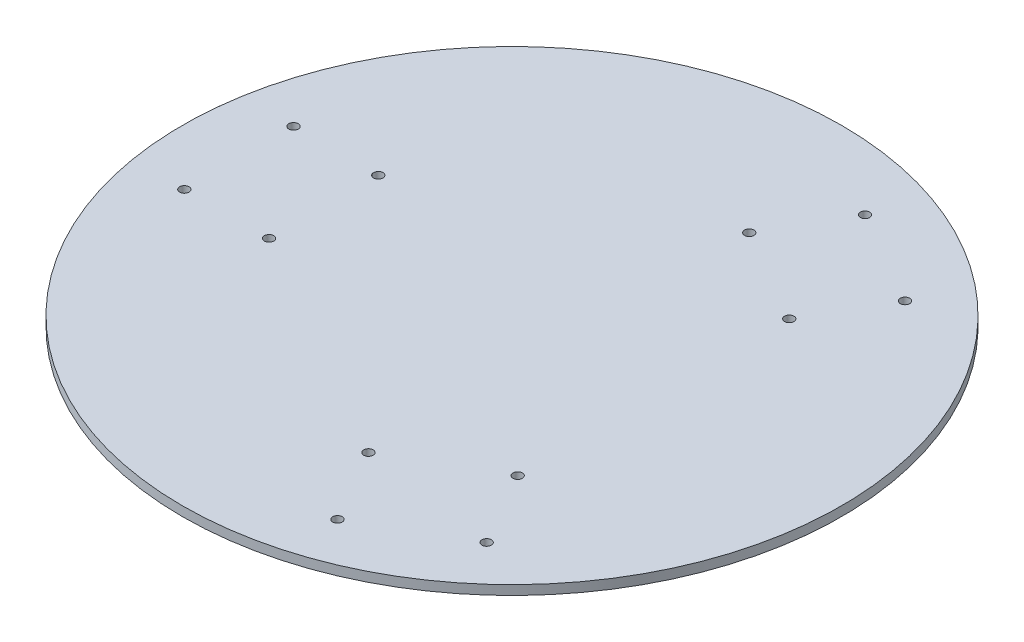
ISO-10303-21;
HEADER;
FILE_DESCRIPTION(('STEP AP214'),'2;1');
FILE_NAME('part.step','',(''),(''),'','','');
FILE_SCHEMA(('AUTOMOTIVE_DESIGN { 1 0 10303 214 1 1 1 1 }'));
ENDSEC;
DATA;
#1=APPLICATION_CONTEXT('core data for automotive mechanical design processes');
#2=APPLICATION_PROTOCOL_DEFINITION('international standard','automotive_design',2000,#1);
#3=PRODUCT_CONTEXT('',#1,'mechanical');
#4=PRODUCT('Part','Part','',(#3));
#5=PRODUCT_RELATED_PRODUCT_CATEGORY('part','',(#4));
#6=PRODUCT_DEFINITION_FORMATION('','',#4);
#7=PRODUCT_DEFINITION_CONTEXT('part definition',#1,'design');
#8=PRODUCT_DEFINITION('design','',#6,#7);
#9=PRODUCT_DEFINITION_SHAPE('','',#8);
#10=(LENGTH_UNIT() NAMED_UNIT(*) SI_UNIT(.MILLI.,.METRE.));
#11=(NAMED_UNIT(*) PLANE_ANGLE_UNIT() SI_UNIT($,.RADIAN.));
#12=(NAMED_UNIT(*) SI_UNIT($,.STERADIAN.) SOLID_ANGLE_UNIT());
#13=UNCERTAINTY_MEASURE_WITH_UNIT(LENGTH_MEASURE(1.E-05),#10,'distance_accuracy_value','');
#14=(GEOMETRIC_REPRESENTATION_CONTEXT(3) GLOBAL_UNCERTAINTY_ASSIGNED_CONTEXT((#13)) GLOBAL_UNIT_ASSIGNED_CONTEXT((#10,
#11,#12)) REPRESENTATION_CONTEXT('',''));
#15=CARTESIAN_POINT('',(0.,0.,0.));
#16=DIRECTION('',(0.,0.,1.));
#17=DIRECTION('',(1.,0.,0.));
#18=AXIS2_PLACEMENT_3D('',#15,#16,#17);
#19=CARTESIAN_POINT('',(0.,5.,0.));
#20=DIRECTION('',(0.,-1.,0.));
#21=DIRECTION('',(0.,0.,-1.));
#22=AXIS2_PLACEMENT_3D('',#19,#20,#21);
#23=CYLINDRICAL_SURFACE('',#22,175.);
#24=CARTESIAN_POINT('',(0.,5.,0.));
#25=DIRECTION('',(0.,1.,0.));
#26=DIRECTION('',(0.,0.,1.));
#27=AXIS2_PLACEMENT_3D('',#24,#25,#26);
#28=CIRCLE('',#27,175.);
#29=CARTESIAN_POINT('',(0.,5.,175.));
#30=VERTEX_POINT('',#29);
#31=EDGE_CURVE('E10',#30,#30,#28,.T.);
#32=ORIENTED_EDGE('',*,*,#31,.F.);
#33=EDGE_LOOP('',(#32));
#34=FACE_BOUND('',#33,.T.);
#35=CARTESIAN_POINT('',(0.,0.,0.));
#36=DIRECTION('',(0.,1.,0.));
#37=DIRECTION('',(0.,0.,1.));
#38=AXIS2_PLACEMENT_3D('',#35,#36,#37);
#39=CIRCLE('',#38,175.);
#40=CARTESIAN_POINT('',(0.,0.,175.));
#41=VERTEX_POINT('',#40);
#42=EDGE_CURVE('E38',#41,#41,#39,.T.);
#43=ORIENTED_EDGE('',*,*,#42,.T.);
#44=EDGE_LOOP('',(#43));
#45=FACE_BOUND('',#44,.T.);
#46=ADVANCED_FACE('F35',(#34,#45),#23,.T.);
#47=CARTESIAN_POINT('',(0.,5.,0.));
#48=DIRECTION('',(0.,1.,0.));
#49=DIRECTION('',(0.,0.,1.));
#50=AXIS2_PLACEMENT_3D('',#47,#48,#49);
#51=PLANE('',#50);
#52=CARTESIAN_POINT('',(97.614736709762,5.,111.073683548731));
#53=DIRECTION('',(0.,1.,0.));
#54=DIRECTION('',(0.,0.,1.));
#55=AXIS2_PLACEMENT_3D('',#52,#53,#54);
#56=CIRCLE('',#55,2.50000000000001);
#57=CARTESIAN_POINT('',(97.614736709762,5.,113.573683548731));
#58=VERTEX_POINT('',#57);
#59=EDGE_CURVE('E110',#58,#58,#56,.T.);
#60=ORIENTED_EDGE('',*,*,#59,.F.);
#61=EDGE_LOOP('',(#60));
#62=FACE_BOUND('',#61,.T.);
#63=CARTESIAN_POINT('',(47.3852632902646,5.,140.073683548731));
#64=DIRECTION('',(0.,1.,0.));
#65=DIRECTION('',(0.,0.,1.));
#66=AXIS2_PLACEMENT_3D('',#63,#64,#65);
#67=CIRCLE('',#66,2.50000000000001);
#68=CARTESIAN_POINT('',(47.3852632902646,5.,142.573683548731));
#69=VERTEX_POINT('',#68);
#70=EDGE_CURVE('E104',#69,#69,#67,.T.);
#71=ORIENTED_EDGE('',*,*,#70,.F.);
#72=EDGE_LOOP('',(#71));
#73=FACE_BOUND('',#72,.T.);
#74=CARTESIAN_POINT('',(75.1147367097619,5.,72.102540378431));
#75=DIRECTION('',(0.,1.,0.));
#76=DIRECTION('',(0.,0.,1.));
#77=AXIS2_PLACEMENT_3D('',#74,#75,#76);
#78=CIRCLE('',#77,2.5);
#79=CARTESIAN_POINT('',(75.1147367097619,5.,74.602540378431));
#80=VERTEX_POINT('',#79);
#81=EDGE_CURVE('E98',#80,#80,#78,.T.);
#82=ORIENTED_EDGE('',*,*,#81,.F.);
#83=EDGE_LOOP('',(#82));
#84=FACE_BOUND('',#83,.T.);
#85=CARTESIAN_POINT('',(24.8852632902645,5.,101.102540378431));
#86=DIRECTION('',(0.,1.,0.));
#87=DIRECTION('',(0.,0.,1.));
#88=AXIS2_PLACEMENT_3D('',#85,#86,#87);
#89=CIRCLE('',#88,2.5);
#90=CARTESIAN_POINT('',(24.8852632902645,5.,103.602540378431));
#91=VERTEX_POINT('',#90);
#92=EDGE_CURVE('E92',#91,#91,#89,.T.);
#93=ORIENTED_EDGE('',*,*,#92,.F.);
#94=EDGE_LOOP('',(#93));
#95=FACE_BOUND('',#94,.T.);
#96=CARTESIAN_POINT('',(-100.,5.,29.));
#97=DIRECTION('',(0.,1.,0.));
#98=DIRECTION('',(0.,0.,1.));
#99=AXIS2_PLACEMENT_3D('',#96,#97,#98);
#100=CIRCLE('',#99,2.50000000000001);
#101=CARTESIAN_POINT('',(-100.,5.,31.5));
#102=VERTEX_POINT('',#101);
#103=EDGE_CURVE('E86',#102,#102,#100,.T.);
#104=ORIENTED_EDGE('',*,*,#103,.F.);
#105=EDGE_LOOP('',(#104));
#106=FACE_BOUND('',#105,.T.);
#107=CARTESIAN_POINT('',(-100.,5.,-29.));
#108=DIRECTION('',(0.,1.,0.));
#109=DIRECTION('',(0.,0.,1.));
#110=AXIS2_PLACEMENT_3D('',#107,#108,#109);
#111=CIRCLE('',#110,2.5);
#112=CARTESIAN_POINT('',(-100.,5.,-26.5));
#113=VERTEX_POINT('',#112);
#114=EDGE_CURVE('E80',#113,#113,#111,.T.);
#115=ORIENTED_EDGE('',*,*,#114,.F.);
#116=EDGE_LOOP('',(#115));
#117=FACE_BOUND('',#116,.T.);
#118=CARTESIAN_POINT('',(-145.,5.,29.));
#119=DIRECTION('',(0.,1.,0.));
#120=DIRECTION('',(0.,0.,1.));
#121=AXIS2_PLACEMENT_3D('',#118,#119,#120);
#122=CIRCLE('',#121,2.5);
#123=CARTESIAN_POINT('',(-145.,5.,31.5));
#124=VERTEX_POINT('',#123);
#125=EDGE_CURVE('E74',#124,#124,#122,.T.);
#126=ORIENTED_EDGE('',*,*,#125,.F.);
#127=EDGE_LOOP('',(#126));
#128=FACE_BOUND('',#127,.T.);
#129=CARTESIAN_POINT('',(-145.,5.,-29.));
#130=DIRECTION('',(0.,1.,0.));
#131=DIRECTION('',(0.,0.,1.));
#132=AXIS2_PLACEMENT_3D('',#129,#130,#131);
#133=CIRCLE('',#132,2.5);
#134=CARTESIAN_POINT('',(-145.,5.,-26.5));
#135=VERTEX_POINT('',#134);
#136=EDGE_CURVE('E68',#135,#135,#133,.T.);
#137=ORIENTED_EDGE('',*,*,#136,.F.);
#138=EDGE_LOOP('',(#137));
#139=FACE_BOUND('',#138,.T.);
#140=CARTESIAN_POINT('',(75.1147367097442,5.,-72.1025403784617));
#141=DIRECTION('',(0.,1.,0.));
#142=DIRECTION('',(0.,0.,1.));
#143=AXIS2_PLACEMENT_3D('',#140,#141,#142);
#144=CIRCLE('',#143,2.5);
#145=CARTESIAN_POINT('',(75.1147367097442,5.,-69.6025403784617));
#146=VERTEX_POINT('',#145);
#147=EDGE_CURVE('E62',#146,#146,#144,.T.);
#148=ORIENTED_EDGE('',*,*,#147,.F.);
#149=EDGE_LOOP('',(#148));
#150=FACE_BOUND('',#149,.T.);
#151=CARTESIAN_POINT('',(24.8852632902468,5.,-101.102540378462));
#152=DIRECTION('',(0.,1.,0.));
#153=DIRECTION('',(0.,0.,1.));
#154=AXIS2_PLACEMENT_3D('',#151,#152,#153);
#155=CIRCLE('',#154,2.5);
#156=CARTESIAN_POINT('',(24.8852632902468,5.,-98.6025403784617));
#157=VERTEX_POINT('',#156);
#158=EDGE_CURVE('E56',#157,#157,#155,.T.);
#159=ORIENTED_EDGE('',*,*,#158,.F.);
#160=EDGE_LOOP('',(#159));
#161=FACE_BOUND('',#160,.T.);
#162=CARTESIAN_POINT('',(97.6147367097442,5.,-111.073683548761));
#163=DIRECTION('',(0.,1.,0.));
#164=DIRECTION('',(0.,0.,1.));
#165=AXIS2_PLACEMENT_3D('',#162,#163,#164);
#166=CIRCLE('',#165,2.5);
#167=CARTESIAN_POINT('',(97.6147367097442,5.,-108.573683548761));
#168=VERTEX_POINT('',#167);
#169=EDGE_CURVE('E50',#168,#168,#166,.T.);
#170=ORIENTED_EDGE('',*,*,#169,.F.);
#171=EDGE_LOOP('',(#170));
#172=FACE_BOUND('',#171,.T.);
#173=CARTESIAN_POINT('',(47.3852632902468,5.,-140.073683548761));
#174=DIRECTION('',(0.,1.,0.));
#175=DIRECTION('',(0.,0.,1.));
#176=AXIS2_PLACEMENT_3D('',#173,#174,#175);
#177=CIRCLE('',#176,2.5);
#178=CARTESIAN_POINT('',(47.3852632902468,5.,-137.573683548761));
#179=VERTEX_POINT('',#178);
#180=EDGE_CURVE('E47',#179,#179,#177,.T.);
#181=ORIENTED_EDGE('',*,*,#180,.F.);
#182=EDGE_LOOP('',(#181));
#183=FACE_BOUND('',#182,.T.);
#184=ORIENTED_EDGE('',*,*,#31,.T.);
#185=EDGE_LOOP('',(#184));
#186=FACE_BOUND('',#185,.T.);
#187=ADVANCED_FACE('F121',(#62,#73,#84,#95,#106,#117,#128,#139,#150,#161,#172,#183,#186),#51,.T.);
#188=CARTESIAN_POINT('',(0.,0.,0.));
#189=DIRECTION('',(0.,1.,0.));
#190=DIRECTION('',(0.,0.,1.));
#191=AXIS2_PLACEMENT_3D('',#188,#189,#190);
#192=PLANE('',#191);
#193=CARTESIAN_POINT('',(97.614736709762,0.,111.073683548731));
#194=DIRECTION('',(0.,1.,0.));
#195=DIRECTION('',(0.,0.,1.));
#196=AXIS2_PLACEMENT_3D('',#193,#194,#195);
#197=CIRCLE('',#196,2.50000000000001);
#198=CARTESIAN_POINT('',(97.614736709762,0.,113.573683548731));
#199=VERTEX_POINT('',#198);
#200=EDGE_CURVE('E113',#199,#199,#197,.T.);
#201=ORIENTED_EDGE('',*,*,#200,.T.);
#202=EDGE_LOOP('',(#201));
#203=FACE_BOUND('',#202,.T.);
#204=CARTESIAN_POINT('',(47.3852632902646,0.,140.073683548731));
#205=DIRECTION('',(0.,1.,0.));
#206=DIRECTION('',(0.,0.,1.));
#207=AXIS2_PLACEMENT_3D('',#204,#205,#206);
#208=CIRCLE('',#207,2.50000000000001);
#209=CARTESIAN_POINT('',(47.3852632902646,0.,142.573683548731));
#210=VERTEX_POINT('',#209);
#211=EDGE_CURVE('E107',#210,#210,#208,.T.);
#212=ORIENTED_EDGE('',*,*,#211,.T.);
#213=EDGE_LOOP('',(#212));
#214=FACE_BOUND('',#213,.T.);
#215=CARTESIAN_POINT('',(75.1147367097619,0.,72.102540378431));
#216=DIRECTION('',(0.,1.,0.));
#217=DIRECTION('',(0.,0.,1.));
#218=AXIS2_PLACEMENT_3D('',#215,#216,#217);
#219=CIRCLE('',#218,2.5);
#220=CARTESIAN_POINT('',(75.1147367097619,0.,74.602540378431));
#221=VERTEX_POINT('',#220);
#222=EDGE_CURVE('E101',#221,#221,#219,.T.);
#223=ORIENTED_EDGE('',*,*,#222,.T.);
#224=EDGE_LOOP('',(#223));
#225=FACE_BOUND('',#224,.T.);
#226=CARTESIAN_POINT('',(24.8852632902645,0.,101.102540378431));
#227=DIRECTION('',(0.,1.,0.));
#228=DIRECTION('',(0.,0.,1.));
#229=AXIS2_PLACEMENT_3D('',#226,#227,#228);
#230=CIRCLE('',#229,2.5);
#231=CARTESIAN_POINT('',(24.8852632902645,0.,103.602540378431));
#232=VERTEX_POINT('',#231);
#233=EDGE_CURVE('E95',#232,#232,#230,.T.);
#234=ORIENTED_EDGE('',*,*,#233,.T.);
#235=EDGE_LOOP('',(#234));
#236=FACE_BOUND('',#235,.T.);
#237=CARTESIAN_POINT('',(-100.,0.,29.));
#238=DIRECTION('',(0.,1.,0.));
#239=DIRECTION('',(0.,0.,1.));
#240=AXIS2_PLACEMENT_3D('',#237,#238,#239);
#241=CIRCLE('',#240,2.50000000000001);
#242=CARTESIAN_POINT('',(-100.,0.,31.5));
#243=VERTEX_POINT('',#242);
#244=EDGE_CURVE('E89',#243,#243,#241,.T.);
#245=ORIENTED_EDGE('',*,*,#244,.T.);
#246=EDGE_LOOP('',(#245));
#247=FACE_BOUND('',#246,.T.);
#248=CARTESIAN_POINT('',(-100.,0.,-29.));
#249=DIRECTION('',(0.,1.,0.));
#250=DIRECTION('',(0.,0.,1.));
#251=AXIS2_PLACEMENT_3D('',#248,#249,#250);
#252=CIRCLE('',#251,2.5);
#253=CARTESIAN_POINT('',(-100.,0.,-26.5));
#254=VERTEX_POINT('',#253);
#255=EDGE_CURVE('E83',#254,#254,#252,.T.);
#256=ORIENTED_EDGE('',*,*,#255,.T.);
#257=EDGE_LOOP('',(#256));
#258=FACE_BOUND('',#257,.T.);
#259=CARTESIAN_POINT('',(-145.,0.,29.));
#260=DIRECTION('',(0.,1.,0.));
#261=DIRECTION('',(0.,0.,1.));
#262=AXIS2_PLACEMENT_3D('',#259,#260,#261);
#263=CIRCLE('',#262,2.5);
#264=CARTESIAN_POINT('',(-145.,0.,31.5));
#265=VERTEX_POINT('',#264);
#266=EDGE_CURVE('E77',#265,#265,#263,.T.);
#267=ORIENTED_EDGE('',*,*,#266,.T.);
#268=EDGE_LOOP('',(#267));
#269=FACE_BOUND('',#268,.T.);
#270=CARTESIAN_POINT('',(-145.,0.,-29.));
#271=DIRECTION('',(0.,1.,0.));
#272=DIRECTION('',(0.,0.,1.));
#273=AXIS2_PLACEMENT_3D('',#270,#271,#272);
#274=CIRCLE('',#273,2.5);
#275=CARTESIAN_POINT('',(-145.,0.,-26.5));
#276=VERTEX_POINT('',#275);
#277=EDGE_CURVE('E71',#276,#276,#274,.T.);
#278=ORIENTED_EDGE('',*,*,#277,.T.);
#279=EDGE_LOOP('',(#278));
#280=FACE_BOUND('',#279,.T.);
#281=CARTESIAN_POINT('',(75.1147367097442,0.,-72.1025403784617));
#282=DIRECTION('',(0.,1.,0.));
#283=DIRECTION('',(0.,0.,1.));
#284=AXIS2_PLACEMENT_3D('',#281,#282,#283);
#285=CIRCLE('',#284,2.5);
#286=CARTESIAN_POINT('',(75.1147367097442,0.,-69.6025403784617));
#287=VERTEX_POINT('',#286);
#288=EDGE_CURVE('E65',#287,#287,#285,.T.);
#289=ORIENTED_EDGE('',*,*,#288,.T.);
#290=EDGE_LOOP('',(#289));
#291=FACE_BOUND('',#290,.T.);
#292=CARTESIAN_POINT('',(24.8852632902468,0.,-101.102540378462));
#293=DIRECTION('',(0.,1.,0.));
#294=DIRECTION('',(0.,0.,1.));
#295=AXIS2_PLACEMENT_3D('',#292,#293,#294);
#296=CIRCLE('',#295,2.5);
#297=CARTESIAN_POINT('',(24.8852632902468,0.,-98.6025403784617));
#298=VERTEX_POINT('',#297);
#299=EDGE_CURVE('E59',#298,#298,#296,.T.);
#300=ORIENTED_EDGE('',*,*,#299,.T.);
#301=EDGE_LOOP('',(#300));
#302=FACE_BOUND('',#301,.T.);
#303=CARTESIAN_POINT('',(97.6147367097442,0.,-111.073683548761));
#304=DIRECTION('',(0.,1.,0.));
#305=DIRECTION('',(0.,0.,1.));
#306=AXIS2_PLACEMENT_3D('',#303,#304,#305);
#307=CIRCLE('',#306,2.5);
#308=CARTESIAN_POINT('',(97.6147367097442,0.,-108.573683548761));
#309=VERTEX_POINT('',#308);
#310=EDGE_CURVE('E53',#309,#309,#307,.T.);
#311=ORIENTED_EDGE('',*,*,#310,.T.);
#312=EDGE_LOOP('',(#311));
#313=FACE_BOUND('',#312,.T.);
#314=CARTESIAN_POINT('',(47.3852632902468,0.,-140.073683548761));
#315=DIRECTION('',(0.,1.,0.));
#316=DIRECTION('',(0.,0.,1.));
#317=AXIS2_PLACEMENT_3D('',#314,#315,#316);
#318=CIRCLE('',#317,2.5);
#319=CARTESIAN_POINT('',(47.3852632902468,0.,-137.573683548761));
#320=VERTEX_POINT('',#319);
#321=EDGE_CURVE('E45',#320,#320,#318,.T.);
#322=ORIENTED_EDGE('',*,*,#321,.T.);
#323=EDGE_LOOP('',(#322));
#324=FACE_BOUND('',#323,.T.);
#325=ORIENTED_EDGE('',*,*,#42,.F.);
#326=EDGE_LOOP('',(#325));
#327=FACE_BOUND('',#326,.T.);
#328=ADVANCED_FACE('F124',(#203,#214,#225,#236,#247,#258,#269,#280,#291,#302,#313,#324,#327),
#192,.F.);
#329=CARTESIAN_POINT('',(47.3852632902468,0.,-140.073683548761));
#330=DIRECTION('',(0.,1.,0.));
#331=DIRECTION('',(0.,0.,1.));
#332=AXIS2_PLACEMENT_3D('',#329,#330,#331);
#333=CYLINDRICAL_SURFACE('',#332,2.5);
#334=ORIENTED_EDGE('',*,*,#321,.F.);
#335=EDGE_LOOP('',(#334));
#336=FACE_BOUND('',#335,.T.);
#337=ORIENTED_EDGE('',*,*,#180,.T.);
#338=EDGE_LOOP('',(#337));
#339=FACE_BOUND('',#338,.T.);
#340=ADVANCED_FACE('F148',(#336,#339),#333,.F.);
#341=CARTESIAN_POINT('',(97.6147367097442,0.,-111.073683548761));
#342=DIRECTION('',(0.,1.,0.));
#343=DIRECTION('',(0.,0.,1.));
#344=AXIS2_PLACEMENT_3D('',#341,#342,#343);
#345=CYLINDRICAL_SURFACE('',#344,2.5);
#346=ORIENTED_EDGE('',*,*,#310,.F.);
#347=EDGE_LOOP('',(#346));
#348=FACE_BOUND('',#347,.T.);
#349=ORIENTED_EDGE('',*,*,#169,.T.);
#350=EDGE_LOOP('',(#349));
#351=FACE_BOUND('',#350,.T.);
#352=ADVANCED_FACE('F150',(#348,#351),#345,.F.);
#353=CARTESIAN_POINT('',(24.8852632902468,0.,-101.102540378462));
#354=DIRECTION('',(0.,1.,0.));
#355=DIRECTION('',(0.,0.,1.));
#356=AXIS2_PLACEMENT_3D('',#353,#354,#355);
#357=CYLINDRICAL_SURFACE('',#356,2.5);
#358=ORIENTED_EDGE('',*,*,#299,.F.);
#359=EDGE_LOOP('',(#358));
#360=FACE_BOUND('',#359,.T.);
#361=ORIENTED_EDGE('',*,*,#158,.T.);
#362=EDGE_LOOP('',(#361));
#363=FACE_BOUND('',#362,.T.);
#364=ADVANCED_FACE('F157',(#360,#363),#357,.F.);
#365=CARTESIAN_POINT('',(75.1147367097442,0.,-72.1025403784617));
#366=DIRECTION('',(0.,1.,0.));
#367=DIRECTION('',(0.,0.,1.));
#368=AXIS2_PLACEMENT_3D('',#365,#366,#367);
#369=CYLINDRICAL_SURFACE('',#368,2.5);
#370=ORIENTED_EDGE('',*,*,#288,.F.);
#371=EDGE_LOOP('',(#370));
#372=FACE_BOUND('',#371,.T.);
#373=ORIENTED_EDGE('',*,*,#147,.T.);
#374=EDGE_LOOP('',(#373));
#375=FACE_BOUND('',#374,.T.);
#376=ADVANCED_FACE('F196',(#372,#375),#369,.F.);
#377=CARTESIAN_POINT('',(-145.,0.,-29.));
#378=DIRECTION('',(0.,1.,0.));
#379=DIRECTION('',(0.,0.,1.));
#380=AXIS2_PLACEMENT_3D('',#377,#378,#379);
#381=CYLINDRICAL_SURFACE('',#380,2.5);
#382=ORIENTED_EDGE('',*,*,#277,.F.);
#383=EDGE_LOOP('',(#382));
#384=FACE_BOUND('',#383,.T.);
#385=ORIENTED_EDGE('',*,*,#136,.T.);
#386=EDGE_LOOP('',(#385));
#387=FACE_BOUND('',#386,.T.);
#388=ADVANCED_FACE('F206',(#384,#387),#381,.F.);
#389=CARTESIAN_POINT('',(-145.,0.,29.));
#390=DIRECTION('',(0.,1.,0.));
#391=DIRECTION('',(0.,0.,1.));
#392=AXIS2_PLACEMENT_3D('',#389,#390,#391);
#393=CYLINDRICAL_SURFACE('',#392,2.5);
#394=ORIENTED_EDGE('',*,*,#266,.F.);
#395=EDGE_LOOP('',(#394));
#396=FACE_BOUND('',#395,.T.);
#397=ORIENTED_EDGE('',*,*,#125,.T.);
#398=EDGE_LOOP('',(#397));
#399=FACE_BOUND('',#398,.T.);
#400=ADVANCED_FACE('F216',(#396,#399),#393,.F.);
#401=CARTESIAN_POINT('',(-100.,0.,-29.));
#402=DIRECTION('',(0.,1.,0.));
#403=DIRECTION('',(0.,0.,1.));
#404=AXIS2_PLACEMENT_3D('',#401,#402,#403);
#405=CYLINDRICAL_SURFACE('',#404,2.5);
#406=ORIENTED_EDGE('',*,*,#255,.F.);
#407=EDGE_LOOP('',(#406));
#408=FACE_BOUND('',#407,.T.);
#409=ORIENTED_EDGE('',*,*,#114,.T.);
#410=EDGE_LOOP('',(#409));
#411=FACE_BOUND('',#410,.T.);
#412=ADVANCED_FACE('F226',(#408,#411),#405,.F.);
#413=CARTESIAN_POINT('',(-100.,0.,29.));
#414=DIRECTION('',(0.,1.,0.));
#415=DIRECTION('',(0.,0.,1.));
#416=AXIS2_PLACEMENT_3D('',#413,#414,#415);
#417=CYLINDRICAL_SURFACE('',#416,2.50000000000001);
#418=ORIENTED_EDGE('',*,*,#244,.F.);
#419=EDGE_LOOP('',(#418));
#420=FACE_BOUND('',#419,.T.);
#421=ORIENTED_EDGE('',*,*,#103,.T.);
#422=EDGE_LOOP('',(#421));
#423=FACE_BOUND('',#422,.T.);
#424=ADVANCED_FACE('F236',(#420,#423),#417,.F.);
#425=CARTESIAN_POINT('',(24.8852632902645,0.,101.102540378431));
#426=DIRECTION('',(0.,1.,0.));
#427=DIRECTION('',(0.,0.,1.));
#428=AXIS2_PLACEMENT_3D('',#425,#426,#427);
#429=CYLINDRICAL_SURFACE('',#428,2.5);
#430=ORIENTED_EDGE('',*,*,#233,.F.);
#431=EDGE_LOOP('',(#430));
#432=FACE_BOUND('',#431,.T.);
#433=ORIENTED_EDGE('',*,*,#92,.T.);
#434=EDGE_LOOP('',(#433));
#435=FACE_BOUND('',#434,.T.);
#436=ADVANCED_FACE('F246',(#432,#435),#429,.F.);
#437=CARTESIAN_POINT('',(75.1147367097619,0.,72.102540378431));
#438=DIRECTION('',(0.,1.,0.));
#439=DIRECTION('',(0.,0.,1.));
#440=AXIS2_PLACEMENT_3D('',#437,#438,#439);
#441=CYLINDRICAL_SURFACE('',#440,2.5);
#442=ORIENTED_EDGE('',*,*,#222,.F.);
#443=EDGE_LOOP('',(#442));
#444=FACE_BOUND('',#443,.T.);
#445=ORIENTED_EDGE('',*,*,#81,.T.);
#446=EDGE_LOOP('',(#445));
#447=FACE_BOUND('',#446,.T.);
#448=ADVANCED_FACE('F256',(#444,#447),#441,.F.);
#449=CARTESIAN_POINT('',(47.3852632902646,0.,140.073683548731));
#450=DIRECTION('',(0.,1.,0.));
#451=DIRECTION('',(0.,0.,1.));
#452=AXIS2_PLACEMENT_3D('',#449,#450,#451);
#453=CYLINDRICAL_SURFACE('',#452,2.50000000000001);
#454=ORIENTED_EDGE('',*,*,#211,.F.);
#455=EDGE_LOOP('',(#454));
#456=FACE_BOUND('',#455,.T.);
#457=ORIENTED_EDGE('',*,*,#70,.T.);
#458=EDGE_LOOP('',(#457));
#459=FACE_BOUND('',#458,.T.);
#460=ADVANCED_FACE('F266',(#456,#459),#453,.F.);
#461=CARTESIAN_POINT('',(97.614736709762,0.,111.073683548731));
#462=DIRECTION('',(0.,1.,0.));
#463=DIRECTION('',(0.,0.,1.));
#464=AXIS2_PLACEMENT_3D('',#461,#462,#463);
#465=CYLINDRICAL_SURFACE('',#464,2.50000000000001);
#466=ORIENTED_EDGE('',*,*,#200,.F.);
#467=EDGE_LOOP('',(#466));
#468=FACE_BOUND('',#467,.T.);
#469=ORIENTED_EDGE('',*,*,#59,.T.);
#470=EDGE_LOOP('',(#469));
#471=FACE_BOUND('',#470,.T.);
#472=ADVANCED_FACE('F119',(#468,#471),#465,.F.);
#473=CLOSED_SHELL('',(#46,#187,#328,#340,#352,#364,#376,#388,#400,#412,#424,#436,#448,#460,#472));
#474=MANIFOLD_SOLID_BREP('B2',#473);
#475=ADVANCED_BREP_SHAPE_REPRESENTATION('',(#18,#474),#14);
#476=SHAPE_DEFINITION_REPRESENTATION(#9,#475);
ENDSEC;
END-ISO-10303-21;
